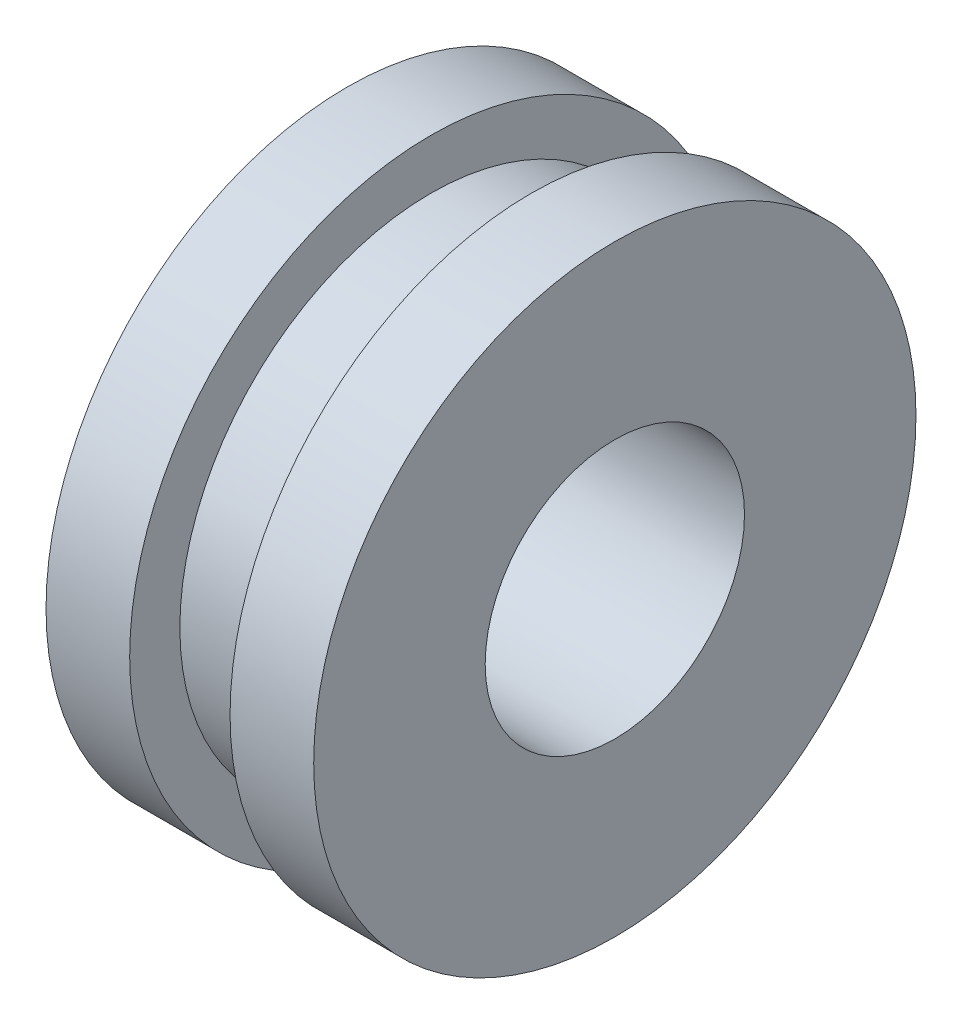
ISO-10303-21;
HEADER;
FILE_DESCRIPTION(('STEP AP214'),'2;1');
FILE_NAME('part.step','',(''),(''),'','','');
FILE_SCHEMA(('AUTOMOTIVE_DESIGN { 1 0 10303 214 1 1 1 1 }'));
ENDSEC;
DATA;
#1=APPLICATION_CONTEXT('core data for automotive mechanical design processes');
#2=APPLICATION_PROTOCOL_DEFINITION('international standard','automotive_design',2000,#1);
#3=PRODUCT_CONTEXT('',#1,'mechanical');
#4=PRODUCT('Part','Part','',(#3));
#5=PRODUCT_RELATED_PRODUCT_CATEGORY('part','',(#4));
#6=PRODUCT_DEFINITION_FORMATION('','',#4);
#7=PRODUCT_DEFINITION_CONTEXT('part definition',#1,'design');
#8=PRODUCT_DEFINITION('design','',#6,#7);
#9=PRODUCT_DEFINITION_SHAPE('','',#8);
#10=(LENGTH_UNIT() NAMED_UNIT(*) SI_UNIT(.MILLI.,.METRE.));
#11=(NAMED_UNIT(*) PLANE_ANGLE_UNIT() SI_UNIT($,.RADIAN.));
#12=(NAMED_UNIT(*) SI_UNIT($,.STERADIAN.) SOLID_ANGLE_UNIT());
#13=UNCERTAINTY_MEASURE_WITH_UNIT(LENGTH_MEASURE(1.E-05),#10,'distance_accuracy_value','');
#14=(GEOMETRIC_REPRESENTATION_CONTEXT(3) GLOBAL_UNCERTAINTY_ASSIGNED_CONTEXT((#13)) GLOBAL_UNIT_ASSIGNED_CONTEXT((#10,
#11,#12)) REPRESENTATION_CONTEXT('',''));
#15=CARTESIAN_POINT('',(0.,0.,0.));
#16=DIRECTION('',(0.,0.,1.));
#17=DIRECTION('',(1.,0.,0.));
#18=AXIS2_PLACEMENT_3D('',#15,#16,#17);
#19=CARTESIAN_POINT('',(-4.,2.,0.));
#20=DIRECTION('',(1.,0.,0.));
#21=DIRECTION('',(0.,0.,-1.));
#22=AXIS2_PLACEMENT_3D('',#19,#20,#21);
#23=PLANE('',#22);
#24=CARTESIAN_POINT('',(-4.,0.,0.));
#25=DIRECTION('',(-1.,0.,0.));
#26=DIRECTION('',(0.,0.,1.));
#27=AXIS2_PLACEMENT_3D('',#24,#25,#26);
#28=CIRCLE('',#27,4.5);
#29=CARTESIAN_POINT('',(-4.,0.,4.5));
#30=VERTEX_POINT('',#29);
#31=EDGE_CURVE('E10',#30,#30,#28,.T.);
#32=ORIENTED_EDGE('',*,*,#31,.F.);
#33=EDGE_LOOP('',(#32));
#34=FACE_BOUND('',#33,.T.);
#35=CARTESIAN_POINT('',(-4.,0.,0.));
#36=DIRECTION('',(1.,0.,0.));
#37=DIRECTION('',(0.,0.,-1.));
#38=AXIS2_PLACEMENT_3D('',#35,#36,#37);
#39=CIRCLE('',#38,9.);
#40=CARTESIAN_POINT('',(-4.,0.,-9.));
#41=VERTEX_POINT('',#40);
#42=EDGE_CURVE('E38',#41,#41,#39,.T.);
#43=ORIENTED_EDGE('',*,*,#42,.F.);
#44=EDGE_LOOP('',(#43));
#45=FACE_BOUND('',#44,.T.);
#46=ADVANCED_FACE('F35',(#34,#45),#23,.F.);
#47=CARTESIAN_POINT('',(4.,2.,0.));
#48=DIRECTION('',(-1.,0.,0.));
#49=DIRECTION('',(0.,0.,1.));
#50=AXIS2_PLACEMENT_3D('',#47,#48,#49);
#51=PLANE('',#50);
#52=CARTESIAN_POINT('',(4.,0.,0.));
#53=DIRECTION('',(-1.,0.,0.));
#54=DIRECTION('',(0.,0.,1.));
#55=AXIS2_PLACEMENT_3D('',#52,#53,#54);
#56=CIRCLE('',#55,3.875);
#57=CARTESIAN_POINT('',(4.,0.,3.875));
#58=VERTEX_POINT('',#57);
#59=EDGE_CURVE('E56',#58,#58,#56,.T.);
#60=ORIENTED_EDGE('',*,*,#59,.T.);
#61=EDGE_LOOP('',(#60));
#62=FACE_BOUND('',#61,.T.);
#63=CARTESIAN_POINT('',(4.,0.,0.));
#64=DIRECTION('',(-1.,0.,0.));
#65=DIRECTION('',(0.,0.,1.));
#66=AXIS2_PLACEMENT_3D('',#63,#64,#65);
#67=CIRCLE('',#66,9.);
#68=CARTESIAN_POINT('',(4.,0.,9.));
#69=VERTEX_POINT('',#68);
#70=EDGE_CURVE('E50',#69,#69,#67,.T.);
#71=ORIENTED_EDGE('',*,*,#70,.F.);
#72=EDGE_LOOP('',(#71));
#73=FACE_BOUND('',#72,.T.);
#74=ADVANCED_FACE('F85',(#62,#73),#51,.F.);
#75=CARTESIAN_POINT('',(-4.,0.,0.));
#76=DIRECTION('',(-1.,0.,0.));
#77=DIRECTION('',(0.,0.,1.));
#78=AXIS2_PLACEMENT_3D('',#75,#76,#77);
#79=CYLINDRICAL_SURFACE('',#78,4.5);
#80=ORIENTED_EDGE('',*,*,#31,.T.);
#81=EDGE_LOOP('',(#80));
#82=FACE_BOUND('',#81,.T.);
#83=CARTESIAN_POINT('',(-3.25,0.,0.));
#84=DIRECTION('',(-1.,0.,0.));
#85=DIRECTION('',(0.,0.,1.));
#86=AXIS2_PLACEMENT_3D('',#83,#84,#85);
#87=CIRCLE('',#86,4.5);
#88=CARTESIAN_POINT('',(-3.25,0.,4.5));
#89=VERTEX_POINT('',#88);
#90=EDGE_CURVE('E42',#89,#89,#87,.T.);
#91=ORIENTED_EDGE('',*,*,#90,.F.);
#92=EDGE_LOOP('',(#91));
#93=FACE_BOUND('',#92,.T.);
#94=ADVANCED_FACE('F76',(#82,#93),#79,.F.);
#95=CARTESIAN_POINT('',(-3.25,4.5,0.));
#96=DIRECTION('',(-1.,0.,0.));
#97=DIRECTION('',(0.,0.,1.));
#98=AXIS2_PLACEMENT_3D('',#95,#96,#97);
#99=PLANE('',#98);
#100=ORIENTED_EDGE('',*,*,#90,.T.);
#101=EDGE_LOOP('',(#100));
#102=FACE_BOUND('',#101,.T.);
#103=CARTESIAN_POINT('',(-3.25,0.,0.));
#104=DIRECTION('',(-1.,0.,0.));
#105=DIRECTION('',(0.,0.,1.));
#106=AXIS2_PLACEMENT_3D('',#103,#104,#105);
#107=CIRCLE('',#106,3.875);
#108=CARTESIAN_POINT('',(-3.25,0.,3.875));
#109=VERTEX_POINT('',#108);
#110=EDGE_CURVE('E47',#109,#109,#107,.T.);
#111=ORIENTED_EDGE('',*,*,#110,.F.);
#112=EDGE_LOOP('',(#111));
#113=FACE_BOUND('',#112,.T.);
#114=ADVANCED_FACE('F74',(#102,#113),#99,.T.);
#115=CARTESIAN_POINT('',(-4.,0.,0.));
#116=DIRECTION('',(-1.,0.,0.));
#117=DIRECTION('',(0.,0.,1.));
#118=AXIS2_PLACEMENT_3D('',#115,#116,#117);
#119=CYLINDRICAL_SURFACE('',#118,3.875);
#120=ORIENTED_EDGE('',*,*,#110,.T.);
#121=EDGE_LOOP('',(#120));
#122=FACE_BOUND('',#121,.T.);
#123=ORIENTED_EDGE('',*,*,#59,.F.);
#124=EDGE_LOOP('',(#123));
#125=FACE_BOUND('',#124,.T.);
#126=ADVANCED_FACE('F71',(#122,#125),#119,.F.);
#127=CARTESIAN_POINT('',(-5.69329324577037,0.,0.));
#128=DIRECTION('',(-1.,0.,0.));
#129=DIRECTION('',(0.,0.,1.));
#130=AXIS2_PLACEMENT_3D('',#127,#128,#129);
#131=CYLINDRICAL_SURFACE('',#130,9.);
#132=CARTESIAN_POINT('',(-1.5,0.,0.));
#133=DIRECTION('',(-1.,0.,0.));
#134=DIRECTION('',(0.,0.,1.));
#135=AXIS2_PLACEMENT_3D('',#132,#133,#134);
#136=CIRCLE('',#135,9.);
#137=CARTESIAN_POINT('',(-1.5,0.,9.));
#138=VERTEX_POINT('',#137);
#139=EDGE_CURVE('E124',#138,#138,#136,.T.);
#140=ORIENTED_EDGE('',*,*,#139,.T.);
#141=EDGE_LOOP('',(#140));
#142=FACE_BOUND('',#141,.T.);
#143=ORIENTED_EDGE('',*,*,#42,.T.);
#144=EDGE_LOOP('',(#143));
#145=FACE_BOUND('',#144,.T.);
#146=ADVANCED_FACE('F83',(#142,#145),#131,.T.);
#147=CARTESIAN_POINT('',(-5.69329324577037,0.,0.));
#148=DIRECTION('',(-1.,0.,0.));
#149=DIRECTION('',(0.,0.,1.));
#150=AXIS2_PLACEMENT_3D('',#147,#148,#149);
#151=CYLINDRICAL_SURFACE('',#150,9.);
#152=CARTESIAN_POINT('',(1.5,0.,0.));
#153=DIRECTION('',(-1.,0.,0.));
#154=DIRECTION('',(0.,0.,1.));
#155=AXIS2_PLACEMENT_3D('',#152,#153,#154);
#156=CIRCLE('',#155,9.);
#157=CARTESIAN_POINT('',(1.5,0.,9.));
#158=VERTEX_POINT('',#157);
#159=EDGE_CURVE('E52',#158,#158,#156,.T.);
#160=ORIENTED_EDGE('',*,*,#159,.F.);
#161=EDGE_LOOP('',(#160));
#162=FACE_BOUND('',#161,.T.);
#163=ORIENTED_EDGE('',*,*,#70,.T.);
#164=EDGE_LOOP('',(#163));
#165=FACE_BOUND('',#164,.T.);
#166=ADVANCED_FACE('F97',(#162,#165),#151,.T.);
#167=CARTESIAN_POINT('',(1.5,9.,0.));
#168=DIRECTION('',(-1.,0.,0.));
#169=DIRECTION('',(0.,0.,1.));
#170=AXIS2_PLACEMENT_3D('',#167,#168,#169);
#171=PLANE('',#170);
#172=ORIENTED_EDGE('',*,*,#159,.T.);
#173=EDGE_LOOP('',(#172));
#174=FACE_BOUND('',#173,.T.);
#175=CARTESIAN_POINT('',(1.5,0.,0.));
#176=DIRECTION('',(-1.,0.,0.));
#177=DIRECTION('',(0.,0.,1.));
#178=AXIS2_PLACEMENT_3D('',#175,#176,#177);
#179=CIRCLE('',#178,7.5);
#180=CARTESIAN_POINT('',(1.5,0.,7.5));
#181=VERTEX_POINT('',#180);
#182=EDGE_CURVE('E58',#181,#181,#179,.T.);
#183=ORIENTED_EDGE('',*,*,#182,.F.);
#184=EDGE_LOOP('',(#183));
#185=FACE_BOUND('',#184,.T.);
#186=ADVANCED_FACE('F103',(#174,#185),#171,.T.);
#187=CARTESIAN_POINT('',(-5.69329324577037,0.,0.));
#188=DIRECTION('',(-1.,0.,0.));
#189=DIRECTION('',(0.,0.,1.));
#190=AXIS2_PLACEMENT_3D('',#187,#188,#189);
#191=CYLINDRICAL_SURFACE('',#190,7.5);
#192=ORIENTED_EDGE('',*,*,#182,.T.);
#193=EDGE_LOOP('',(#192));
#194=FACE_BOUND('',#193,.T.);
#195=CARTESIAN_POINT('',(-1.5,0.,0.));
#196=DIRECTION('',(-1.,0.,0.));
#197=DIRECTION('',(0.,0.,1.));
#198=AXIS2_PLACEMENT_3D('',#195,#196,#197);
#199=CIRCLE('',#198,7.5);
#200=CARTESIAN_POINT('',(-1.5,0.,7.5));
#201=VERTEX_POINT('',#200);
#202=EDGE_CURVE('E63',#201,#201,#199,.T.);
#203=ORIENTED_EDGE('',*,*,#202,.F.);
#204=EDGE_LOOP('',(#203));
#205=FACE_BOUND('',#204,.T.);
#206=ADVANCED_FACE('F111',(#194,#205),#191,.T.);
#207=CARTESIAN_POINT('',(-1.5,7.5,0.));
#208=DIRECTION('',(1.,0.,0.));
#209=DIRECTION('',(0.,0.,-1.));
#210=AXIS2_PLACEMENT_3D('',#207,#208,#209);
#211=PLANE('',#210);
#212=ORIENTED_EDGE('',*,*,#202,.T.);
#213=EDGE_LOOP('',(#212));
#214=FACE_BOUND('',#213,.T.);
#215=ORIENTED_EDGE('',*,*,#139,.F.);
#216=EDGE_LOOP('',(#215));
#217=FACE_BOUND('',#216,.T.);
#218=ADVANCED_FACE('F108',(#214,#217),#211,.T.);
#219=CLOSED_SHELL('',(#46,#74,#94,#114,#126,#146,#166,#186,#206,#218));
#220=MANIFOLD_SOLID_BREP('B2',#219);
#221=ADVANCED_BREP_SHAPE_REPRESENTATION('',(#18,#220),#14);
#222=SHAPE_DEFINITION_REPRESENTATION(#9,#221);
ENDSEC;
END-ISO-10303-21;
